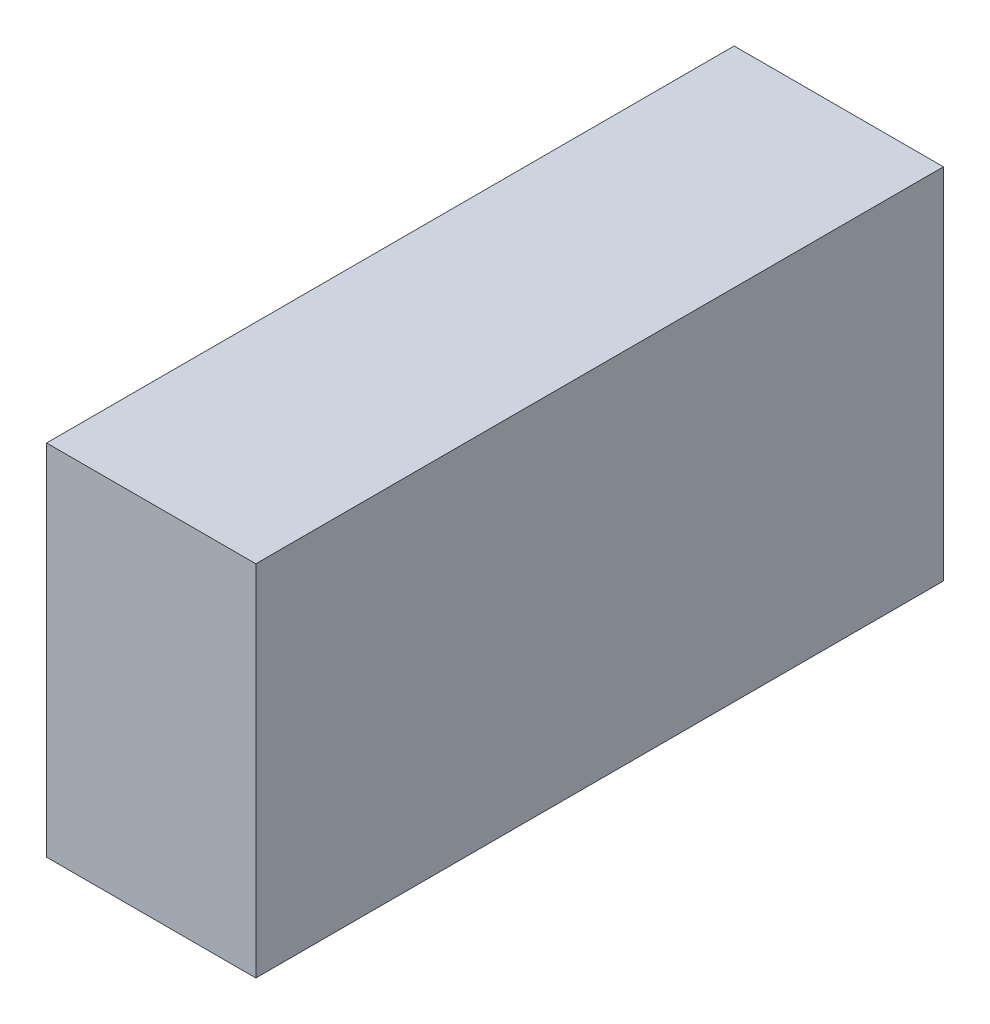
ISO-10303-21;
HEADER;
FILE_DESCRIPTION(('STEP AP214'),'2;1');
FILE_NAME('part.step','',(''),(''),'','','');
FILE_SCHEMA(('AUTOMOTIVE_DESIGN { 1 0 10303 214 1 1 1 1 }'));
ENDSEC;
DATA;
#1=APPLICATION_CONTEXT('core data for automotive mechanical design processes');
#2=APPLICATION_PROTOCOL_DEFINITION('international standard','automotive_design',2000,#1);
#3=PRODUCT_CONTEXT('',#1,'mechanical');
#4=PRODUCT('Part','Part','',(#3));
#5=PRODUCT_RELATED_PRODUCT_CATEGORY('part','',(#4));
#6=PRODUCT_DEFINITION_FORMATION('','',#4);
#7=PRODUCT_DEFINITION_CONTEXT('part definition',#1,'design');
#8=PRODUCT_DEFINITION('design','',#6,#7);
#9=PRODUCT_DEFINITION_SHAPE('','',#8);
#10=(LENGTH_UNIT() NAMED_UNIT(*) SI_UNIT(.MILLI.,.METRE.));
#11=(NAMED_UNIT(*) PLANE_ANGLE_UNIT() SI_UNIT($,.RADIAN.));
#12=(NAMED_UNIT(*) SI_UNIT($,.STERADIAN.) SOLID_ANGLE_UNIT());
#13=UNCERTAINTY_MEASURE_WITH_UNIT(LENGTH_MEASURE(1.E-05),#10,'distance_accuracy_value','');
#14=(GEOMETRIC_REPRESENTATION_CONTEXT(3) GLOBAL_UNCERTAINTY_ASSIGNED_CONTEXT((#13)) GLOBAL_UNIT_ASSIGNED_CONTEXT((#10,
#11,#12)) REPRESENTATION_CONTEXT('',''));
#15=CARTESIAN_POINT('',(0.,0.,0.));
#16=DIRECTION('',(0.,0.,1.));
#17=DIRECTION('',(1.,0.,0.));
#18=AXIS2_PLACEMENT_3D('',#15,#16,#17);
#19=CARTESIAN_POINT('',(88.8999999999999,152.4,584.2));
#20=DIRECTION('',(-1.,0.,0.));
#21=DIRECTION('',(0.,-1.,0.));
#22=AXIS2_PLACEMENT_3D('',#19,#20,#21);
#23=PLANE('',#22);
#24=DIRECTION('',(0.,1.,0.));
#25=VECTOR('',#24,1.);
#26=CARTESIAN_POINT('',(88.8999999999999,152.4,0.));
#27=LINE('',#26,#25);
#28=CARTESIAN_POINT('',(88.9,-152.4,0.));
#29=VERTEX_POINT('',#28);
#30=CARTESIAN_POINT('',(88.8999999999999,152.4,0.));
#31=VERTEX_POINT('',#30);
#32=EDGE_CURVE('E113',#29,#31,#27,.T.);
#33=ORIENTED_EDGE('',*,*,#32,.T.);
#34=DIRECTION('',(0.,0.,-1.));
#35=VECTOR('',#34,1.);
#36=CARTESIAN_POINT('',(88.8999999999999,152.4,584.2));
#37=LINE('',#36,#35);
#38=CARTESIAN_POINT('',(88.8999999999999,152.4,584.2));
#39=VERTEX_POINT('',#38);
#40=EDGE_CURVE('E11',#39,#31,#37,.T.);
#41=ORIENTED_EDGE('',*,*,#40,.F.);
#42=DIRECTION('',(0.,1.,0.));
#43=VECTOR('',#42,1.);
#44=CARTESIAN_POINT('',(88.8999999999999,152.4,584.2));
#45=LINE('',#44,#43);
#46=CARTESIAN_POINT('',(88.9,-152.4,584.2));
#47=VERTEX_POINT('',#46);
#48=EDGE_CURVE('E97',#47,#39,#45,.T.);
#49=ORIENTED_EDGE('',*,*,#48,.F.);
#50=DIRECTION('',(0.,0.,-1.));
#51=VECTOR('',#50,1.);
#52=CARTESIAN_POINT('',(88.9,-152.4,584.2));
#53=LINE('',#52,#51);
#54=EDGE_CURVE('E109',#47,#29,#53,.T.);
#55=ORIENTED_EDGE('',*,*,#54,.T.);
#56=EDGE_LOOP('',(#33,#41,#49,#55));
#57=FACE_BOUND('',#56,.T.);
#58=ADVANCED_FACE('F45',(#57),#23,.F.);
#59=CARTESIAN_POINT('',(-88.9,152.4,584.2));
#60=DIRECTION('',(0.,-1.,0.));
#61=DIRECTION('',(0.,0.,-1.));
#62=AXIS2_PLACEMENT_3D('',#59,#60,#61);
#63=PLANE('',#62);
#64=DIRECTION('',(-1.,0.,0.));
#65=VECTOR('',#64,1.);
#66=CARTESIAN_POINT('',(-88.9,152.4,0.));
#67=LINE('',#66,#65);
#68=CARTESIAN_POINT('',(-88.9,152.4,0.));
#69=VERTEX_POINT('',#68);
#70=EDGE_CURVE('E102',#31,#69,#67,.T.);
#71=ORIENTED_EDGE('',*,*,#70,.T.);
#72=DIRECTION('',(0.,0.,-1.));
#73=VECTOR('',#72,1.);
#74=CARTESIAN_POINT('',(-88.9,152.4,584.2));
#75=LINE('',#74,#73);
#76=CARTESIAN_POINT('',(-88.9,152.4,584.2));
#77=VERTEX_POINT('',#76);
#78=EDGE_CURVE('E54',#77,#69,#75,.T.);
#79=ORIENTED_EDGE('',*,*,#78,.F.);
#80=DIRECTION('',(-1.,0.,0.));
#81=VECTOR('',#80,1.);
#82=CARTESIAN_POINT('',(-88.9,152.4,584.2));
#83=LINE('',#82,#81);
#84=EDGE_CURVE('E92',#39,#77,#83,.T.);
#85=ORIENTED_EDGE('',*,*,#84,.F.);
#86=ORIENTED_EDGE('',*,*,#40,.T.);
#87=EDGE_LOOP('',(#71,#79,#85,#86));
#88=FACE_BOUND('',#87,.T.);
#89=ADVANCED_FACE('F101',(#88),#63,.F.);
#90=CARTESIAN_POINT('',(-88.9,152.4,584.2));
#91=DIRECTION('',(1.,0.,0.));
#92=DIRECTION('',(0.,1.,0.));
#93=AXIS2_PLACEMENT_3D('',#90,#91,#92);
#94=PLANE('',#93);
#95=DIRECTION('',(0.,-1.,0.));
#96=VECTOR('',#95,1.);
#97=CARTESIAN_POINT('',(-88.9,152.4,0.));
#98=LINE('',#97,#96);
#99=CARTESIAN_POINT('',(-88.9,-152.4,0.));
#100=VERTEX_POINT('',#99);
#101=EDGE_CURVE('E79',#69,#100,#98,.T.);
#102=ORIENTED_EDGE('',*,*,#101,.T.);
#103=DIRECTION('',(0.,0.,-1.));
#104=VECTOR('',#103,1.);
#105=CARTESIAN_POINT('',(-88.9,-152.4,584.2));
#106=LINE('',#105,#104);
#107=CARTESIAN_POINT('',(-88.9,-152.4,584.2));
#108=VERTEX_POINT('',#107);
#109=EDGE_CURVE('E104',#108,#100,#106,.T.);
#110=ORIENTED_EDGE('',*,*,#109,.F.);
#111=DIRECTION('',(0.,-1.,0.));
#112=VECTOR('',#111,1.);
#113=CARTESIAN_POINT('',(-88.9,152.4,584.2));
#114=LINE('',#113,#112);
#115=EDGE_CURVE('E95',#77,#108,#114,.T.);
#116=ORIENTED_EDGE('',*,*,#115,.F.);
#117=ORIENTED_EDGE('',*,*,#78,.T.);
#118=EDGE_LOOP('',(#102,#110,#116,#117));
#119=FACE_BOUND('',#118,.T.);
#120=ADVANCED_FACE('F105',(#119),#94,.F.);
#121=CARTESIAN_POINT('',(-88.9,-152.4,584.2));
#122=DIRECTION('',(0.,1.,0.));
#123=DIRECTION('',(0.,0.,1.));
#124=AXIS2_PLACEMENT_3D('',#121,#122,#123);
#125=PLANE('',#124);
#126=DIRECTION('',(1.,0.,0.));
#127=VECTOR('',#126,1.);
#128=CARTESIAN_POINT('',(-88.9,-152.4,0.));
#129=LINE('',#128,#127);
#130=EDGE_CURVE('E85',#100,#29,#129,.T.);
#131=ORIENTED_EDGE('',*,*,#130,.T.);
#132=ORIENTED_EDGE('',*,*,#54,.F.);
#133=DIRECTION('',(1.,0.,0.));
#134=VECTOR('',#133,1.);
#135=CARTESIAN_POINT('',(-88.9,-152.4,584.2));
#136=LINE('',#135,#134);
#137=EDGE_CURVE('E62',#108,#47,#136,.T.);
#138=ORIENTED_EDGE('',*,*,#137,.F.);
#139=ORIENTED_EDGE('',*,*,#109,.T.);
#140=EDGE_LOOP('',(#131,#132,#138,#139));
#141=FACE_BOUND('',#140,.T.);
#142=ADVANCED_FACE('F126',(#141),#125,.F.);
#143=CARTESIAN_POINT('',(0.,0.,584.2));
#144=DIRECTION('',(0.,0.,1.));
#145=DIRECTION('',(1.,0.,0.));
#146=AXIS2_PLACEMENT_3D('',#143,#144,#145);
#147=PLANE('',#146);
#148=ORIENTED_EDGE('',*,*,#48,.T.);
#149=ORIENTED_EDGE('',*,*,#84,.T.);
#150=ORIENTED_EDGE('',*,*,#115,.T.);
#151=ORIENTED_EDGE('',*,*,#137,.T.);
#152=EDGE_LOOP('',(#148,#149,#150,#151));
#153=FACE_BOUND('',#152,.T.);
#154=ADVANCED_FACE('F93',(#153),#147,.T.);
#155=CARTESIAN_POINT('',(0.,0.,0.));
#156=DIRECTION('',(0.,0.,1.));
#157=DIRECTION('',(1.,0.,0.));
#158=AXIS2_PLACEMENT_3D('',#155,#156,#157);
#159=PLANE('',#158);
#160=ORIENTED_EDGE('',*,*,#32,.F.);
#161=ORIENTED_EDGE('',*,*,#130,.F.);
#162=ORIENTED_EDGE('',*,*,#101,.F.);
#163=ORIENTED_EDGE('',*,*,#70,.F.);
#164=EDGE_LOOP('',(#160,#161,#162,#163));
#165=FACE_BOUND('',#164,.T.);
#166=ADVANCED_FACE('F129',(#165),#159,.F.);
#167=CLOSED_SHELL('',(#58,#89,#120,#142,#154,#166));
#168=MANIFOLD_SOLID_BREP('B2',#167);
#169=ADVANCED_BREP_SHAPE_REPRESENTATION('',(#18,#168),#14);
#170=SHAPE_DEFINITION_REPRESENTATION(#9,#169);
ENDSEC;
END-ISO-10303-21;
